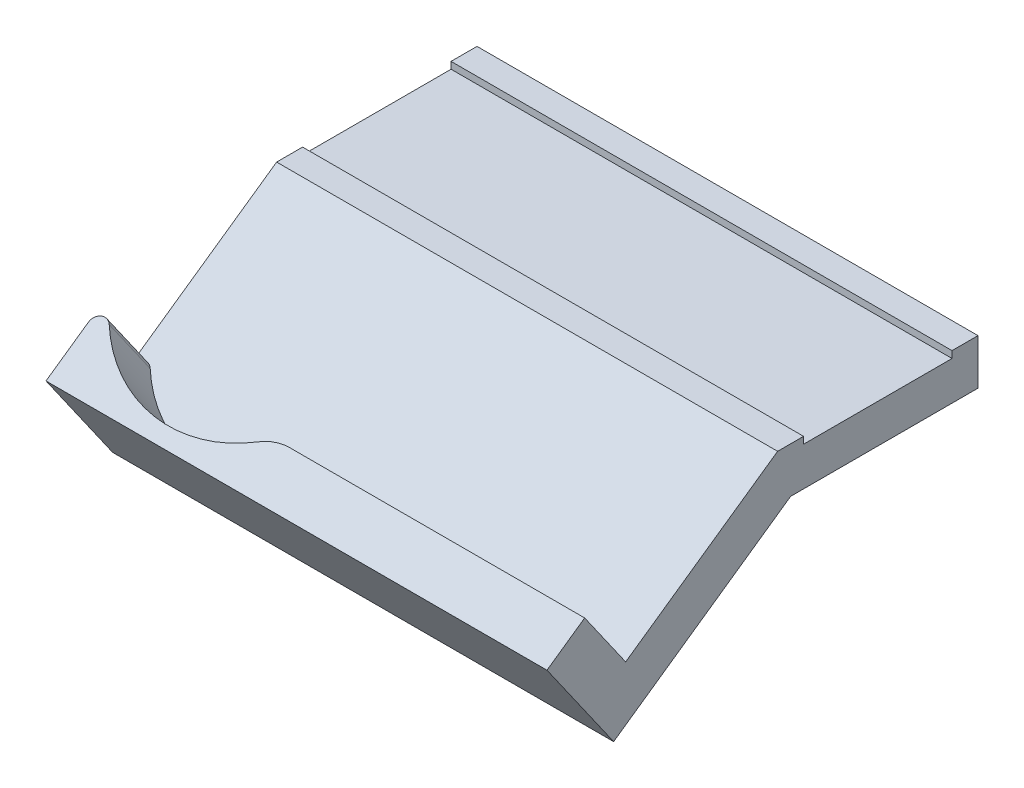
ISO-10303-21;
HEADER;
FILE_DESCRIPTION(('STEP AP214'),'2;1');
FILE_NAME('part.step','',(''),(''),'','','');
FILE_SCHEMA(('AUTOMOTIVE_DESIGN { 1 0 10303 214 1 1 1 1 }'));
ENDSEC;
DATA;
#1=APPLICATION_CONTEXT('core data for automotive mechanical design processes');
#2=APPLICATION_PROTOCOL_DEFINITION('international standard','automotive_design',2000,#1);
#3=PRODUCT_CONTEXT('',#1,'mechanical');
#4=PRODUCT('Part','Part','',(#3));
#5=PRODUCT_RELATED_PRODUCT_CATEGORY('part','',(#4));
#6=PRODUCT_DEFINITION_FORMATION('','',#4);
#7=PRODUCT_DEFINITION_CONTEXT('part definition',#1,'design');
#8=PRODUCT_DEFINITION('design','',#6,#7);
#9=PRODUCT_DEFINITION_SHAPE('','',#8);
#10=(LENGTH_UNIT() NAMED_UNIT(*) SI_UNIT(.MILLI.,.METRE.));
#11=(NAMED_UNIT(*) PLANE_ANGLE_UNIT() SI_UNIT($,.RADIAN.));
#12=(NAMED_UNIT(*) SI_UNIT($,.STERADIAN.) SOLID_ANGLE_UNIT());
#13=UNCERTAINTY_MEASURE_WITH_UNIT(LENGTH_MEASURE(1.E-05),#10,'distance_accuracy_value','');
#14=(GEOMETRIC_REPRESENTATION_CONTEXT(3) GLOBAL_UNCERTAINTY_ASSIGNED_CONTEXT((#13)) GLOBAL_UNIT_ASSIGNED_CONTEXT((#10,
#11,#12)) REPRESENTATION_CONTEXT('',''));
#15=CARTESIAN_POINT('',(0.,0.,0.));
#16=DIRECTION('',(0.,0.,1.));
#17=DIRECTION('',(1.,0.,0.));
#18=AXIS2_PLACEMENT_3D('',#15,#16,#17);
#19=CARTESIAN_POINT('',(55.,18.2536319186698,-46.5));
#20=DIRECTION('',(0.,-1.,0.));
#21=DIRECTION('',(0.,0.,-1.));
#22=AXIS2_PLACEMENT_3D('',#19,#20,#21);
#23=PLANE('',#22);
#24=DIRECTION('',(0.,0.,1.));
#25=VECTOR('',#24,1.);
#26=CARTESIAN_POINT('',(0.,18.2536319186698,-46.5));
#27=LINE('',#26,#25);
#28=CARTESIAN_POINT('',(0.,18.2536319186698,-46.5));
#29=VERTEX_POINT('',#28);
#30=CARTESIAN_POINT('',(0.,18.2536319186698,-43.65));
#31=VERTEX_POINT('',#30);
#32=EDGE_CURVE('E216',#29,#31,#27,.T.);
#33=ORIENTED_EDGE('',*,*,#32,.T.);
#34=DIRECTION('',(-1.,0.,0.));
#35=VECTOR('',#34,1.);
#36=CARTESIAN_POINT('',(0.,18.2536319186698,-43.65));
#37=LINE('',#36,#35);
#38=CARTESIAN_POINT('',(55.,18.2536319186698,-43.65));
#39=VERTEX_POINT('',#38);
#40=EDGE_CURVE('E180',#39,#31,#37,.T.);
#41=ORIENTED_EDGE('',*,*,#40,.F.);
#42=DIRECTION('',(0.,0.,1.));
#43=VECTOR('',#42,1.);
#44=CARTESIAN_POINT('',(55.,18.2536319186698,-46.5));
#45=LINE('',#44,#43);
#46=CARTESIAN_POINT('',(55.,18.2536319186698,-46.5));
#47=VERTEX_POINT('',#46);
#48=EDGE_CURVE('E212',#47,#39,#45,.T.);
#49=ORIENTED_EDGE('',*,*,#48,.F.);
#50=DIRECTION('',(1.,0.,0.));
#51=VECTOR('',#50,1.);
#52=CARTESIAN_POINT('',(55.,18.2536319186698,-46.5));
#53=LINE('',#52,#51);
#54=EDGE_CURVE('E209',#29,#47,#53,.T.);
#55=ORIENTED_EDGE('',*,*,#54,.F.);
#56=EDGE_LOOP('',(#33,#41,#49,#55));
#57=FACE_BOUND('',#56,.T.);
#58=ADVANCED_FACE('F34',(#57),#23,.F.);
#59=CARTESIAN_POINT('',(0.,50.,-29.));
#60=DIRECTION('',(1.,0.,0.));
#61=DIRECTION('',(0.,0.,-1.));
#62=AXIS2_PLACEMENT_3D('',#59,#60,#61);
#63=PLANE('',#62);
#64=DIRECTION('',(0.,0.,1.));
#65=VECTOR('',#64,1.);
#66=CARTESIAN_POINT('',(0.,17.5036319186698,-43.65));
#67=LINE('',#66,#65);
#68=CARTESIAN_POINT('',(0.,17.5036319186698,-43.65));
#69=VERTEX_POINT('',#68);
#70=CARTESIAN_POINT('',(0.,17.5036319186698,-27.35));
#71=VERTEX_POINT('',#70);
#72=EDGE_CURVE('E176',#69,#71,#67,.T.);
#73=ORIENTED_EDGE('',*,*,#72,.F.);
#74=DIRECTION('',(0.,1.,0.));
#75=VECTOR('',#74,1.);
#76=CARTESIAN_POINT('',(0.,17.5036319186698,-43.65));
#77=LINE('',#76,#75);
#78=EDGE_CURVE('E190',#69,#31,#77,.T.);
#79=ORIENTED_EDGE('',*,*,#78,.T.);
#80=ORIENTED_EDGE('',*,*,#32,.F.);
#81=DIRECTION('',(0.,1.,0.));
#82=VECTOR('',#81,1.);
#83=CARTESIAN_POINT('',(0.,18.2536319186698,-46.5));
#84=LINE('',#83,#82);
#85=CARTESIAN_POINT('',(0.,13.2536319186698,-46.5));
#86=VERTEX_POINT('',#85);
#87=EDGE_CURVE('E207',#86,#29,#84,.T.);
#88=ORIENTED_EDGE('',*,*,#87,.F.);
#89=DIRECTION('',(0.,0.,1.));
#90=VECTOR('',#89,1.);
#91=CARTESIAN_POINT('',(0.,13.2536319186698,-46.5));
#92=LINE('',#91,#90);
#93=CARTESIAN_POINT('',(0.,13.2536319186698,-25.9281480067421));
#94=VERTEX_POINT('',#93);
#95=EDGE_CURVE('E219',#86,#94,#92,.T.);
#96=ORIENTED_EDGE('',*,*,#95,.T.);
#97=DIRECTION('',(0.,-0.573576436351042,0.819152044288995));
#98=VECTOR('',#97,1.);
#99=CARTESIAN_POINT('',(0.,12.2536319186698,-24.5));
#100=LINE('',#99,#98);
#101=CARTESIAN_POINT('',(0.,-0.350155711852337,-6.49992581806871));
#102=VERTEX_POINT('',#101);
#103=EDGE_CURVE('E220',#94,#102,#100,.T.);
#104=ORIENTED_EDGE('',*,*,#103,.T.);
#105=DIRECTION('',(0.,0.819152044288995,0.573576436351042));
#106=VECTOR('',#105,1.);
#107=CARTESIAN_POINT('',(0.,10.1025707484643,0.819152044289007));
#108=LINE('',#107,#106);
#109=CARTESIAN_POINT('',(0.,10.1025707484643,0.819152044289006));
#110=VERTEX_POINT('',#109);
#111=EDGE_CURVE('E172',#102,#110,#108,.T.);
#112=ORIENTED_EDGE('',*,*,#111,.T.);
#113=DIRECTION('',(0.,0.573576436351044,-0.819152044288993));
#114=VECTOR('',#113,1.);
#115=CARTESIAN_POINT('',(0.,6.69090166682914,5.69152044288993));
#116=LINE('',#115,#114);
#117=CARTESIAN_POINT('',(0.,13.3566866817595,-3.82820713955443));
#118=VERTEX_POINT('',#117);
#119=EDGE_CURVE('E155',#110,#118,#116,.T.);
#120=ORIENTED_EDGE('',*,*,#119,.T.);
#121=DIRECTION('',(0.,0.819152044288995,0.573576436351042));
#122=VECTOR('',#121,1.);
#123=CARTESIAN_POINT('',(0.,6.93002065141996,-8.32820713955442));
#124=LINE('',#123,#122);
#125=CARTESIAN_POINT('',(0.,6.93002065141996,-8.32820713955443));
#126=VERTEX_POINT('',#125);
#127=EDGE_CURVE('E247',#118,#126,#124,.F.);
#128=ORIENTED_EDGE('',*,*,#127,.T.);
#129=DIRECTION('',(0.,-0.573576436351042,0.819152044288995));
#130=VECTOR('',#129,1.);
#131=CARTESIAN_POINT('',(0.,30.81217567548,-42.4354592338724));
#132=LINE('',#131,#130);
#133=CARTESIAN_POINT('',(0.,18.2536319186698,-24.5));
#134=VERTEX_POINT('',#133);
#135=EDGE_CURVE('E230',#134,#126,#132,.T.);
#136=ORIENTED_EDGE('',*,*,#135,.F.);
#137=CARTESIAN_POINT('',(0.,18.2536319186698,-27.35));
#138=VERTEX_POINT('',#137);
#139=EDGE_CURVE('E215',#138,#134,#27,.T.);
#140=ORIENTED_EDGE('',*,*,#139,.F.);
#141=DIRECTION('',(0.,1.,0.));
#142=VECTOR('',#141,1.);
#143=CARTESIAN_POINT('',(0.,17.5036319186698,-27.35));
#144=LINE('',#143,#142);
#145=EDGE_CURVE('E51',#71,#138,#144,.T.);
#146=ORIENTED_EDGE('',*,*,#145,.F.);
#147=EDGE_LOOP('',(#73,#79,#80,#88,#96,#104,#112,#120,#128,#136,#140,#146));
#148=FACE_BOUND('',#147,.T.);
#149=ADVANCED_FACE('F272',(#148),#63,.F.);
#150=CARTESIAN_POINT('',(55.,50.,-29.));
#151=DIRECTION('',(1.,0.,0.));
#152=DIRECTION('',(0.,0.,-1.));
#153=AXIS2_PLACEMENT_3D('',#150,#151,#152);
#154=PLANE('',#153);
#155=DIRECTION('',(0.,1.,0.));
#156=VECTOR('',#155,1.);
#157=CARTESIAN_POINT('',(55.,17.5036319186698,-43.65));
#158=LINE('',#157,#156);
#159=CARTESIAN_POINT('',(55.,17.5036319186698,-43.65));
#160=VERTEX_POINT('',#159);
#161=EDGE_CURVE('E194',#160,#39,#158,.T.);
#162=ORIENTED_EDGE('',*,*,#161,.F.);
#163=DIRECTION('',(0.,0.,-1.));
#164=VECTOR('',#163,1.);
#165=CARTESIAN_POINT('',(55.,17.5036319186698,-43.65));
#166=LINE('',#165,#164);
#167=CARTESIAN_POINT('',(55.,17.5036319186698,-27.35));
#168=VERTEX_POINT('',#167);
#169=EDGE_CURVE('E183',#168,#160,#166,.T.);
#170=ORIENTED_EDGE('',*,*,#169,.F.);
#171=DIRECTION('',(0.,1.,0.));
#172=VECTOR('',#171,1.);
#173=CARTESIAN_POINT('',(55.,17.5036319186698,-27.35));
#174=LINE('',#173,#172);
#175=CARTESIAN_POINT('',(55.,18.2536319186698,-27.35));
#176=VERTEX_POINT('',#175);
#177=EDGE_CURVE('E196',#168,#176,#174,.T.);
#178=ORIENTED_EDGE('',*,*,#177,.T.);
#179=CARTESIAN_POINT('',(55.,18.2536319186698,-24.5));
#180=VERTEX_POINT('',#179);
#181=EDGE_CURVE('E211',#176,#180,#45,.T.);
#182=ORIENTED_EDGE('',*,*,#181,.T.);
#183=DIRECTION('',(0.,0.573576436351042,-0.819152044288995));
#184=VECTOR('',#183,1.);
#185=CARTESIAN_POINT('',(55.,6.,-7.));
#186=LINE('',#185,#184);
#187=CARTESIAN_POINT('',(55.,6.57357643635104,-7.819152044289));
#188=VERTEX_POINT('',#187);
#189=EDGE_CURVE('E238',#188,#180,#186,.T.);
#190=ORIENTED_EDGE('',*,*,#189,.F.);
#191=DIRECTION('',(0.,0.819152044288995,0.573576436351042));
#192=VECTOR('',#191,1.);
#193=CARTESIAN_POINT('',(55.,6.57357643635104,-7.819152044289));
#194=LINE('',#193,#192);
#195=CARTESIAN_POINT('',(55.,13.0002424666906,-3.319152044289));
#196=VERTEX_POINT('',#195);
#197=EDGE_CURVE('E152',#188,#196,#194,.T.);
#198=ORIENTED_EDGE('',*,*,#197,.T.);
#199=DIRECTION('',(0.,0.573576436351044,-0.819152044288993));
#200=VECTOR('',#199,1.);
#201=CARTESIAN_POINT('',(55.,6.69090166682914,5.69152044288993));
#202=LINE('',#201,#200);
#203=CARTESIAN_POINT('',(55.,10.1025707484643,0.819152044288993));
#204=VERTEX_POINT('',#203);
#205=EDGE_CURVE('E144',#204,#196,#202,.T.);
#206=ORIENTED_EDGE('',*,*,#205,.F.);
#207=DIRECTION('',(0.,-0.819152044288995,-0.573576436351042));
#208=VECTOR('',#207,1.);
#209=CARTESIAN_POINT('',(55.,10.1025707484643,0.819152044288993));
#210=LINE('',#209,#208);
#211=CARTESIAN_POINT('',(55.,-0.350155711852337,-6.49992581806872));
#212=VERTEX_POINT('',#211);
#213=EDGE_CURVE('E149',#204,#212,#210,.T.);
#214=ORIENTED_EDGE('',*,*,#213,.T.);
#215=DIRECTION('',(0.,-0.573576436351042,0.819152044288995));
#216=VECTOR('',#215,1.);
#217=CARTESIAN_POINT('',(55.,12.2536319186698,-24.5));
#218=LINE('',#217,#216);
#219=CARTESIAN_POINT('',(55.,13.2536319186698,-25.9281480067421));
#220=VERTEX_POINT('',#219);
#221=EDGE_CURVE('E223',#220,#212,#218,.T.);
#222=ORIENTED_EDGE('',*,*,#221,.F.);
#223=DIRECTION('',(0.,0.,1.));
#224=VECTOR('',#223,1.);
#225=CARTESIAN_POINT('',(55.,13.2536319186698,-46.5));
#226=LINE('',#225,#224);
#227=CARTESIAN_POINT('',(55.,13.2536319186698,-46.5));
#228=VERTEX_POINT('',#227);
#229=EDGE_CURVE('E225',#228,#220,#226,.T.);
#230=ORIENTED_EDGE('',*,*,#229,.F.);
#231=DIRECTION('',(0.,-1.,0.));
#232=VECTOR('',#231,1.);
#233=CARTESIAN_POINT('',(55.,18.2536319186698,-46.5));
#234=LINE('',#233,#232);
#235=EDGE_CURVE('E202',#47,#228,#234,.T.);
#236=ORIENTED_EDGE('',*,*,#235,.F.);
#237=ORIENTED_EDGE('',*,*,#48,.T.);
#238=EDGE_LOOP('',(#162,#170,#178,#182,#190,#198,#206,#214,#222,#230,#236,#237));
#239=FACE_BOUND('',#238,.T.);
#240=ADVANCED_FACE('F147',(#239),#154,.T.);
#241=CARTESIAN_POINT('',(5.,6.,-7.));
#242=DIRECTION('',(0.,-0.819152044288995,-0.573576436351042));
#243=DIRECTION('',(0.,0.573576436351042,-0.819152044288995));
#244=AXIS2_PLACEMENT_3D('',#241,#242,#243);
#245=PLANE('',#244);
#246=ORIENTED_EDGE('',*,*,#189,.T.);
#247=DIRECTION('',(1.,0.,0.));
#248=VECTOR('',#247,1.);
#249=CARTESIAN_POINT('',(0.,18.2536319186698,-24.5));
#250=LINE('',#249,#248);
#251=EDGE_CURVE('E222',#134,#180,#250,.T.);
#252=ORIENTED_EDGE('',*,*,#251,.F.);
#253=ORIENTED_EDGE('',*,*,#135,.T.);
#254=CARTESIAN_POINT('',(1.,6.93002065141996,-8.32820713955443));
#255=DIRECTION('',(0.,-0.819152044288995,-0.573576436351042));
#256=DIRECTION('',(0.,0.573576436351042,-0.819152044288995));
#257=AXIS2_PLACEMENT_3D('',#254,#255,#256);
#258=CIRCLE('',#257,1.);
#259=CARTESIAN_POINT('',(1.74576271186441,7.31214396193832,-8.87393578380094));
#260=VERTEX_POINT('',#259);
#261=EDGE_CURVE('E250',#126,#260,#258,.T.);
#262=ORIENTED_EDGE('',*,*,#261,.T.);
#263=CARTESIAN_POINT('',(12.,12.5663394815658,-16.3777046421904));
#264=DIRECTION('',(0.,0.819152044288995,0.573576436351042));
#265=DIRECTION('',(0.,-0.573576436351042,0.819152044288995));
#266=AXIS2_PLACEMENT_3D('',#263,#264,#265);
#267=CIRCLE('',#266,13.75);
#268=CARTESIAN_POINT('',(19.7926745718327,6.06853298178783,-7.09787524133638));
#269=VERTEX_POINT('',#268);
#270=EDGE_CURVE('E228',#260,#269,#267,.T.);
#271=ORIENTED_EDGE('',*,*,#270,.T.);
#272=CARTESIAN_POINT('',(22.6263744161355,3.70569425459583,-3.72339182284401));
#273=DIRECTION('',(0.,-0.819152044288995,-0.573576436351042));
#274=DIRECTION('',(0.,0.573576436351042,-0.819152044288995));
#275=AXIS2_PLACEMENT_3D('',#272,#273,#274);
#276=CIRCLE('',#275,5.);
#277=CARTESIAN_POINT('',(22.6263744161355,6.57357643635104,-7.819152044289));
#278=VERTEX_POINT('',#277);
#279=EDGE_CURVE('E11',#269,#278,#276,.T.);
#280=ORIENTED_EDGE('',*,*,#279,.T.);
#281=DIRECTION('',(1.,0.,0.));
#282=VECTOR('',#281,1.);
#283=CARTESIAN_POINT('',(0.,6.57357643635104,-7.819152044289));
#284=LINE('',#283,#282);
#285=EDGE_CURVE('E235',#278,#188,#284,.T.);
#286=ORIENTED_EDGE('',*,*,#285,.T.);
#287=EDGE_LOOP('',(#246,#252,#253,#262,#271,#280,#286));
#288=FACE_BOUND('',#287,.T.);
#289=ADVANCED_FACE('F294',(#288),#245,.F.);
#290=CARTESIAN_POINT('',(0.,6.57357643635104,-7.819152044289));
#291=DIRECTION('',(0.,0.573576436351042,-0.819152044288995));
#292=DIRECTION('',(0.,0.819152044288995,0.573576436351042));
#293=AXIS2_PLACEMENT_3D('',#290,#291,#292);
#294=PLANE('',#293);
#295=ORIENTED_EDGE('',*,*,#285,.F.);
#296=DIRECTION('',(0.,-0.819152044288995,-0.573576436351042));
#297=VECTOR('',#296,1.);
#298=CARTESIAN_POINT('',(22.6263744161355,6.57357643635104,-7.819152044289));
#299=LINE('',#298,#297);
#300=CARTESIAN_POINT('',(22.6263744161355,13.0002424666906,-3.319152044289));
#301=VERTEX_POINT('',#300);
#302=EDGE_CURVE('E252',#278,#301,#299,.F.);
#303=ORIENTED_EDGE('',*,*,#302,.T.);
#304=DIRECTION('',(1.,0.,0.));
#305=VECTOR('',#304,1.);
#306=CARTESIAN_POINT('',(0.,13.0002424666906,-3.319152044289));
#307=LINE('',#306,#305);
#308=EDGE_CURVE('E156',#301,#196,#307,.T.);
#309=ORIENTED_EDGE('',*,*,#308,.T.);
#310=ORIENTED_EDGE('',*,*,#197,.F.);
#311=EDGE_LOOP('',(#295,#303,#309,#310));
#312=FACE_BOUND('',#311,.T.);
#313=ADVANCED_FACE('F297',(#312),#294,.T.);
#314=CARTESIAN_POINT('',(0.,6.69090166682914,5.69152044288993));
#315=DIRECTION('',(0.,-0.819152044288993,-0.573576436351044));
#316=DIRECTION('',(0.,0.573576436351044,-0.819152044288993));
#317=AXIS2_PLACEMENT_3D('',#314,#315,#316);
#318=PLANE('',#317);
#319=ORIENTED_EDGE('',*,*,#308,.F.);
#320=CARTESIAN_POINT('',(22.6263744161355,10.1323602849354,0.776608177155982));
#321=DIRECTION('',(0.,-0.819152044288993,-0.573576436351044));
#322=DIRECTION('',(0.,0.573576436351044,-0.819152044288993));
#323=AXIS2_PLACEMENT_3D('',#320,#321,#322);
#324=CIRCLE('',#323,5.);
#325=CARTESIAN_POINT('',(19.7926745718327,12.4951990121274,-2.59787524133638));
#326=VERTEX_POINT('',#325);
#327=EDGE_CURVE('E255',#301,#326,#324,.F.);
#328=ORIENTED_EDGE('',*,*,#327,.T.);
#329=CARTESIAN_POINT('',(12.,18.9930055119055,-11.8777046421904));
#330=DIRECTION('',(0.,-0.819152044288993,-0.573576436351044));
#331=DIRECTION('',(0.,0.573576436351044,-0.819152044288993));
#332=AXIS2_PLACEMENT_3D('',#329,#330,#331);
#333=CIRCLE('',#332,13.75);
#334=CARTESIAN_POINT('',(1.74576271186441,13.7388099922779,-4.37393578380093));
#335=VERTEX_POINT('',#334);
#336=EDGE_CURVE('E232',#335,#326,#333,.F.);
#337=ORIENTED_EDGE('',*,*,#336,.F.);
#338=CARTESIAN_POINT('',(1.,13.3566866817595,-3.82820713955443));
#339=DIRECTION('',(0.,-0.819152044288993,-0.573576436351044));
#340=DIRECTION('',(0.,0.573576436351044,-0.819152044288993));
#341=AXIS2_PLACEMENT_3D('',#338,#339,#340);
#342=CIRCLE('',#341,1.);
#343=EDGE_CURVE('E245',#335,#118,#342,.F.);
#344=ORIENTED_EDGE('',*,*,#343,.T.);
#345=ORIENTED_EDGE('',*,*,#119,.F.);
#346=DIRECTION('',(1.,0.,0.));
#347=VECTOR('',#346,1.);
#348=CARTESIAN_POINT('',(-13.7043840278394,10.1025707484643,0.819152044289009));
#349=LINE('',#348,#347);
#350=EDGE_CURVE('E159',#110,#204,#349,.T.);
#351=ORIENTED_EDGE('',*,*,#350,.T.);
#352=ORIENTED_EDGE('',*,*,#205,.T.);
#353=EDGE_LOOP('',(#319,#328,#337,#344,#345,#351,#352));
#354=FACE_BOUND('',#353,.T.);
#355=ADVANCED_FACE('F160',(#354),#318,.F.);
#356=CARTESIAN_POINT('',(12.,45.3797068074815,6.59846251345962));
#357=DIRECTION('',(0.,-0.819152044288995,-0.573576436351042));
#358=DIRECTION('',(0.,0.573576436351042,-0.819152044288995));
#359=AXIS2_PLACEMENT_3D('',#356,#357,#358);
#360=CYLINDRICAL_SURFACE('',#359,13.75);
#361=ORIENTED_EDGE('',*,*,#336,.T.);
#362=DIRECTION('',(0.,-0.819152044288995,-0.573576436351042));
#363=VECTOR('',#362,1.);
#364=CARTESIAN_POINT('',(19.7926745718327,38.8819003077034,15.8782919143137));
#365=LINE('',#364,#363);
#366=EDGE_CURVE('E43',#326,#269,#365,.T.);
#367=ORIENTED_EDGE('',*,*,#366,.T.);
#368=ORIENTED_EDGE('',*,*,#270,.F.);
#369=DIRECTION('',(0.,-0.819152044288995,-0.573576436351042));
#370=VECTOR('',#369,1.);
#371=CARTESIAN_POINT('',(1.74576271186441,40.1255112878539,14.1022313718491));
#372=LINE('',#371,#370);
#373=EDGE_CURVE('E242',#260,#335,#372,.F.);
#374=ORIENTED_EDGE('',*,*,#373,.T.);
#375=EDGE_LOOP('',(#361,#367,#368,#374));
#376=FACE_BOUND('',#375,.T.);
#377=ADVANCED_FACE('F301',(#376),#360,.F.);
#378=CARTESIAN_POINT('',(1.,39.7433879773356,14.6479600160956));
#379=DIRECTION('',(0.,-0.819152044288995,-0.573576436351042));
#380=DIRECTION('',(0.,0.573576436351042,-0.819152044288995));
#381=AXIS2_PLACEMENT_3D('',#378,#379,#380);
#382=CYLINDRICAL_SURFACE('',#381,1.);
#383=ORIENTED_EDGE('',*,*,#261,.F.);
#384=ORIENTED_EDGE('',*,*,#127,.F.);
#385=ORIENTED_EDGE('',*,*,#343,.F.);
#386=ORIENTED_EDGE('',*,*,#373,.F.);
#387=EDGE_LOOP('',(#383,#384,#385,#386));
#388=FACE_BOUND('',#387,.T.);
#389=ADVANCED_FACE('F306',(#388),#382,.T.);
#390=CARTESIAN_POINT('',(22.6263744161355,36.5190615805114,19.252775332806));
#391=DIRECTION('',(0.,-0.819152044288995,-0.573576436351042));
#392=DIRECTION('',(0.,0.573576436351042,-0.819152044288995));
#393=AXIS2_PLACEMENT_3D('',#390,#391,#392);
#394=CYLINDRICAL_SURFACE('',#393,5.);
#395=ORIENTED_EDGE('',*,*,#279,.F.);
#396=ORIENTED_EDGE('',*,*,#366,.F.);
#397=ORIENTED_EDGE('',*,*,#327,.F.);
#398=ORIENTED_EDGE('',*,*,#302,.F.);
#399=EDGE_LOOP('',(#395,#396,#397,#398));
#400=FACE_BOUND('',#399,.T.);
#401=ADVANCED_FACE('F36',(#400),#394,.T.);
#402=CARTESIAN_POINT('',(0.,12.2536319186698,-24.5));
#403=DIRECTION('',(0.,0.819152044288995,0.573576436351042));
#404=DIRECTION('',(0.,-0.573576436351042,0.819152044288995));
#405=AXIS2_PLACEMENT_3D('',#402,#403,#404);
#406=PLANE('',#405);
#407=ORIENTED_EDGE('',*,*,#221,.T.);
#408=DIRECTION('',(1.,0.,0.));
#409=VECTOR('',#408,1.);
#410=CARTESIAN_POINT('',(-13.7043840278394,-0.350155711852337,-6.4999258180687));
#411=LINE('',#410,#409);
#412=EDGE_CURVE('E165',#102,#212,#411,.T.);
#413=ORIENTED_EDGE('',*,*,#412,.F.);
#414=ORIENTED_EDGE('',*,*,#103,.F.);
#415=DIRECTION('',(-1.,0.,0.));
#416=VECTOR('',#415,1.);
#417=CARTESIAN_POINT('',(55.,13.2536319186698,-25.9281480067421));
#418=LINE('',#417,#416);
#419=EDGE_CURVE('E193',#220,#94,#418,.T.);
#420=ORIENTED_EDGE('',*,*,#419,.F.);
#421=EDGE_LOOP('',(#407,#413,#414,#420));
#422=FACE_BOUND('',#421,.T.);
#423=ADVANCED_FACE('F269',(#422),#406,.F.);
#424=CARTESIAN_POINT('',(55.,13.2536319186698,-46.5));
#425=DIRECTION('',(0.,1.,0.));
#426=DIRECTION('',(0.,0.,1.));
#427=AXIS2_PLACEMENT_3D('',#424,#425,#426);
#428=PLANE('',#427);
#429=ORIENTED_EDGE('',*,*,#229,.T.);
#430=ORIENTED_EDGE('',*,*,#419,.T.);
#431=ORIENTED_EDGE('',*,*,#95,.F.);
#432=DIRECTION('',(-1.,0.,0.));
#433=VECTOR('',#432,1.);
#434=CARTESIAN_POINT('',(55.,13.2536319186698,-46.5));
#435=LINE('',#434,#433);
#436=EDGE_CURVE('E205',#228,#86,#435,.T.);
#437=ORIENTED_EDGE('',*,*,#436,.F.);
#438=EDGE_LOOP('',(#429,#430,#431,#437));
#439=FACE_BOUND('',#438,.T.);
#440=ADVANCED_FACE('F264',(#439),#428,.F.);
#441=ORIENTED_EDGE('',*,*,#181,.F.);
#442=DIRECTION('',(1.,0.,0.));
#443=VECTOR('',#442,1.);
#444=CARTESIAN_POINT('',(0.,18.2536319186698,-27.35));
#445=LINE('',#444,#443);
#446=EDGE_CURVE('E175',#138,#176,#445,.T.);
#447=ORIENTED_EDGE('',*,*,#446,.F.);
#448=ORIENTED_EDGE('',*,*,#139,.T.);
#449=ORIENTED_EDGE('',*,*,#251,.T.);
#450=EDGE_LOOP('',(#441,#447,#448,#449));
#451=FACE_BOUND('',#450,.T.);
#452=ADVANCED_FACE('F292',(#451),#23,.F.);
#453=CARTESIAN_POINT('',(0.,0.,-46.5));
#454=DIRECTION('',(0.,0.,-1.));
#455=DIRECTION('',(-1.,0.,0.));
#456=AXIS2_PLACEMENT_3D('',#453,#454,#455);
#457=PLANE('',#456);
#458=ORIENTED_EDGE('',*,*,#235,.T.);
#459=ORIENTED_EDGE('',*,*,#436,.T.);
#460=ORIENTED_EDGE('',*,*,#87,.T.);
#461=ORIENTED_EDGE('',*,*,#54,.T.);
#462=EDGE_LOOP('',(#458,#459,#460,#461));
#463=FACE_BOUND('',#462,.T.);
#464=ADVANCED_FACE('F277',(#463),#457,.T.);
#465=CARTESIAN_POINT('',(0.,17.5036319186698,-43.65));
#466=DIRECTION('',(0.,0.,-1.));
#467=DIRECTION('',(-1.,0.,0.));
#468=AXIS2_PLACEMENT_3D('',#465,#466,#467);
#469=PLANE('',#468);
#470=ORIENTED_EDGE('',*,*,#40,.T.);
#471=ORIENTED_EDGE('',*,*,#78,.F.);
#472=DIRECTION('',(-1.,0.,0.));
#473=VECTOR('',#472,1.);
#474=CARTESIAN_POINT('',(0.,17.5036319186698,-43.65));
#475=LINE('',#474,#473);
#476=EDGE_CURVE('E185',#160,#69,#475,.T.);
#477=ORIENTED_EDGE('',*,*,#476,.F.);
#478=ORIENTED_EDGE('',*,*,#161,.T.);
#479=EDGE_LOOP('',(#470,#471,#477,#478));
#480=FACE_BOUND('',#479,.T.);
#481=ADVANCED_FACE('F284',(#480),#469,.F.);
#482=CARTESIAN_POINT('',(0.,17.5036319186698,-27.35));
#483=DIRECTION('',(0.,0.,1.));
#484=DIRECTION('',(1.,0.,0.));
#485=AXIS2_PLACEMENT_3D('',#482,#483,#484);
#486=PLANE('',#485);
#487=ORIENTED_EDGE('',*,*,#446,.T.);
#488=ORIENTED_EDGE('',*,*,#177,.F.);
#489=DIRECTION('',(1.,0.,0.));
#490=VECTOR('',#489,1.);
#491=CARTESIAN_POINT('',(0.,17.5036319186698,-27.35));
#492=LINE('',#491,#490);
#493=EDGE_CURVE('E179',#71,#168,#492,.T.);
#494=ORIENTED_EDGE('',*,*,#493,.F.);
#495=ORIENTED_EDGE('',*,*,#145,.T.);
#496=EDGE_LOOP('',(#487,#488,#494,#495));
#497=FACE_BOUND('',#496,.T.);
#498=ADVANCED_FACE('F385',(#497),#486,.F.);
#499=CARTESIAN_POINT('',(0.,17.5036319186698,0.));
#500=DIRECTION('',(0.,1.,0.));
#501=DIRECTION('',(0.,0.,1.));
#502=AXIS2_PLACEMENT_3D('',#499,#500,#501);
#503=PLANE('',#502);
#504=ORIENTED_EDGE('',*,*,#72,.T.);
#505=ORIENTED_EDGE('',*,*,#493,.T.);
#506=ORIENTED_EDGE('',*,*,#169,.T.);
#507=ORIENTED_EDGE('',*,*,#476,.T.);
#508=EDGE_LOOP('',(#504,#505,#506,#507));
#509=FACE_BOUND('',#508,.T.);
#510=ADVANCED_FACE('F286',(#509),#503,.T.);
#511=CARTESIAN_POINT('',(-13.7043840278394,10.1025707484643,0.819152044289009));
#512=DIRECTION('',(0.,-0.573576436351042,0.819152044288994));
#513=DIRECTION('',(0.,-0.819152044288995,-0.573576436351042));
#514=AXIS2_PLACEMENT_3D('',#511,#512,#513);
#515=PLANE('',#514);
#516=ORIENTED_EDGE('',*,*,#111,.F.);
#517=ORIENTED_EDGE('',*,*,#412,.T.);
#518=ORIENTED_EDGE('',*,*,#213,.F.);
#519=ORIENTED_EDGE('',*,*,#350,.F.);
#520=EDGE_LOOP('',(#516,#517,#518,#519));
#521=FACE_BOUND('',#520,.T.);
#522=ADVANCED_FACE('F168',(#521),#515,.T.);
#523=CLOSED_SHELL('',(#58,#149,#240,#289,#313,#355,#377,#389,#401,#423,#440,#452,#464,#481,#498,
#510,#522));
#524=MANIFOLD_SOLID_BREP('B2',#523);
#525=ADVANCED_BREP_SHAPE_REPRESENTATION('',(#18,#524),#14);
#526=SHAPE_DEFINITION_REPRESENTATION(#9,#525);
ENDSEC;
END-ISO-10303-21;
